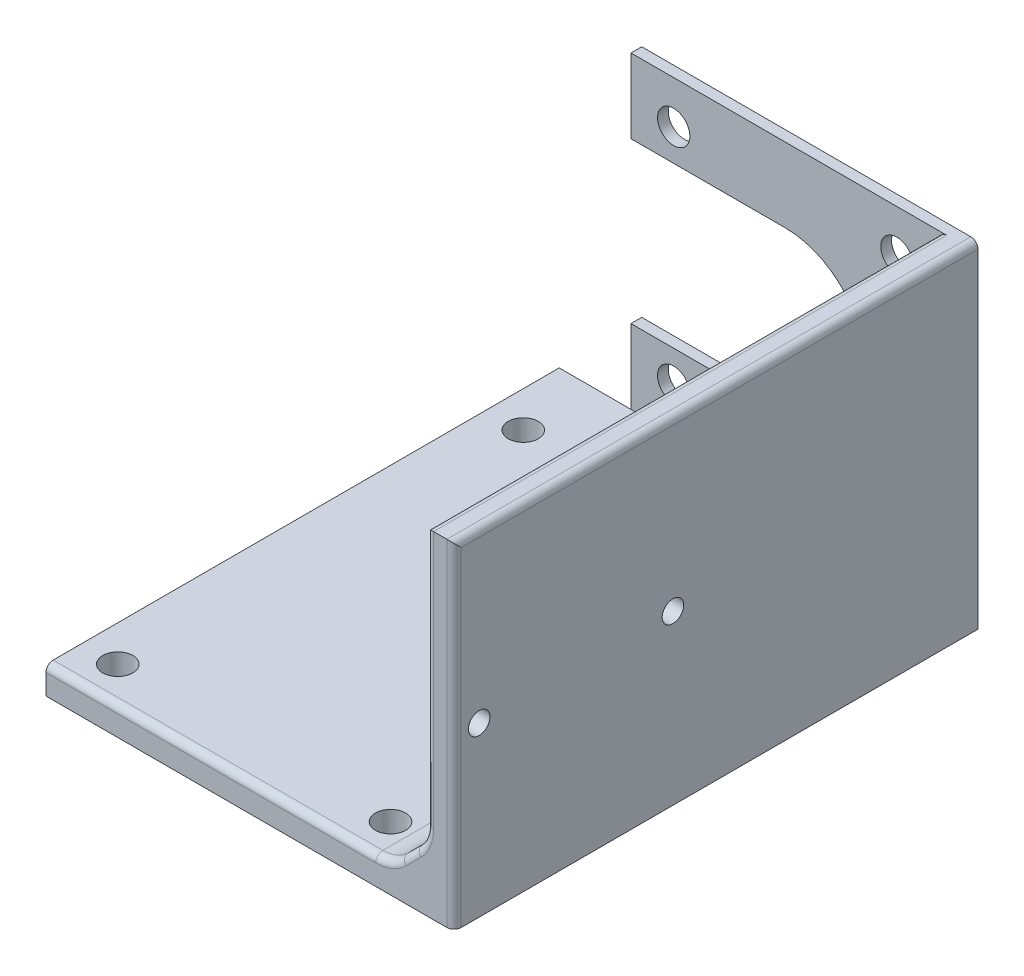
ISO-10303-21;
HEADER;
FILE_DESCRIPTION(('STEP AP214'),'2;1');
FILE_NAME('part.step','',(''),(''),'','','');
FILE_SCHEMA(('AUTOMOTIVE_DESIGN { 1 0 10303 214 1 1 1 1 }'));
ENDSEC;
DATA;
#1=APPLICATION_CONTEXT('core data for automotive mechanical design processes');
#2=APPLICATION_PROTOCOL_DEFINITION('international standard','automotive_design',2000,#1);
#3=PRODUCT_CONTEXT('',#1,'mechanical');
#4=PRODUCT('Part','Part','',(#3));
#5=PRODUCT_RELATED_PRODUCT_CATEGORY('part','',(#4));
#6=PRODUCT_DEFINITION_FORMATION('','',#4);
#7=PRODUCT_DEFINITION_CONTEXT('part definition',#1,'design');
#8=PRODUCT_DEFINITION('design','',#6,#7);
#9=PRODUCT_DEFINITION_SHAPE('','',#8);
#10=(LENGTH_UNIT() NAMED_UNIT(*) SI_UNIT(.MILLI.,.METRE.));
#11=(NAMED_UNIT(*) PLANE_ANGLE_UNIT() SI_UNIT($,.RADIAN.));
#12=(NAMED_UNIT(*) SI_UNIT($,.STERADIAN.) SOLID_ANGLE_UNIT());
#13=UNCERTAINTY_MEASURE_WITH_UNIT(LENGTH_MEASURE(1.E-05),#10,'distance_accuracy_value','');
#14=(GEOMETRIC_REPRESENTATION_CONTEXT(3) GLOBAL_UNCERTAINTY_ASSIGNED_CONTEXT((#13)) GLOBAL_UNIT_ASSIGNED_CONTEXT((#10,
#11,#12)) REPRESENTATION_CONTEXT('',''));
#15=CARTESIAN_POINT('',(0.,0.,0.));
#16=DIRECTION('',(0.,0.,1.));
#17=DIRECTION('',(1.,0.,0.));
#18=AXIS2_PLACEMENT_3D('',#15,#16,#17);
#19=CARTESIAN_POINT('',(43.,46.85,39.));
#20=DIRECTION('',(1.,0.,0.));
#21=DIRECTION('',(0.,0.,-1.));
#22=AXIS2_PLACEMENT_3D('',#19,#20,#21);
#23=PLANE('',#22);
#24=CARTESIAN_POINT('',(43.,23.425,42.5));
#25=DIRECTION('',(1.,0.,0.));
#26=DIRECTION('',(0.,0.,-1.));
#27=AXIS2_PLACEMENT_3D('',#24,#25,#26);
#28=CIRCLE('',#27,1.5);
#29=CARTESIAN_POINT('',(43.,23.425,41.));
#30=VERTEX_POINT('',#29);
#31=EDGE_CURVE('E239',#30,#30,#28,.T.);
#32=ORIENTED_EDGE('',*,*,#31,.T.);
#33=EDGE_LOOP('',(#32));
#34=FACE_BOUND('',#33,.T.);
#35=CARTESIAN_POINT('',(43.,23.425,69.5));
#36=DIRECTION('',(1.,0.,0.));
#37=DIRECTION('',(0.,0.,-1.));
#38=AXIS2_PLACEMENT_3D('',#35,#36,#37);
#39=CIRCLE('',#38,1.5);
#40=CARTESIAN_POINT('',(43.,23.425,68.));
#41=VERTEX_POINT('',#40);
#42=EDGE_CURVE('E246',#41,#41,#39,.T.);
#43=ORIENTED_EDGE('',*,*,#42,.T.);
#44=EDGE_LOOP('',(#43));
#45=FACE_BOUND('',#44,.T.);
#46=DIRECTION('',(0.,0.,1.));
#47=VECTOR('',#46,1.);
#48=CARTESIAN_POINT('',(43.,10.9210678118655,39.));
#49=LINE('',#48,#47);
#50=CARTESIAN_POINT('',(43.,10.9210678118655,43.));
#51=VERTEX_POINT('',#50);
#52=CARTESIAN_POINT('',(43.,10.9210678118655,72.));
#53=VERTEX_POINT('',#52);
#54=EDGE_CURVE('E392',#51,#53,#49,.T.);
#55=ORIENTED_EDGE('',*,*,#54,.T.);
#56=DIRECTION('',(0.,1.,0.));
#57=VECTOR('',#56,1.);
#58=CARTESIAN_POINT('',(43.,46.85,72.));
#59=LINE('',#58,#57);
#60=CARTESIAN_POINT('',(43.,45.85,72.));
#61=VERTEX_POINT('',#60);
#62=EDGE_CURVE('E438',#53,#61,#59,.T.);
#63=ORIENTED_EDGE('',*,*,#62,.T.);
#64=DIRECTION('',(0.,0.,-1.));
#65=VECTOR('',#64,1.);
#66=CARTESIAN_POINT('',(43.,45.85,39.));
#67=LINE('',#66,#65);
#68=CARTESIAN_POINT('',(43.,45.85,1.5));
#69=VERTEX_POINT('',#68);
#70=EDGE_CURVE('E435',#61,#69,#67,.T.);
#71=ORIENTED_EDGE('',*,*,#70,.T.);
#72=DIRECTION('',(0.,1.,0.));
#73=VECTOR('',#72,1.);
#74=CARTESIAN_POINT('',(43.,0.,1.5));
#75=LINE('',#74,#73);
#76=CARTESIAN_POINT('',(43.,3.85,1.5));
#77=VERTEX_POINT('',#76);
#78=EDGE_CURVE('E289',#77,#69,#75,.T.);
#79=ORIENTED_EDGE('',*,*,#78,.F.);
#80=DIRECTION('',(0.,0.,-1.));
#81=VECTOR('',#80,1.);
#82=CARTESIAN_POINT('',(43.,3.85,39.));
#83=LINE('',#82,#81);
#84=CARTESIAN_POINT('',(43.,3.85,43.));
#85=VERTEX_POINT('',#84);
#86=EDGE_CURVE('E361',#85,#77,#83,.T.);
#87=ORIENTED_EDGE('',*,*,#86,.F.);
#88=DIRECTION('',(0.,1.,0.));
#89=VECTOR('',#88,1.);
#90=CARTESIAN_POINT('',(43.,3.85,43.));
#91=LINE('',#90,#89);
#92=EDGE_CURVE('E481',#85,#51,#91,.T.);
#93=ORIENTED_EDGE('',*,*,#92,.T.);
#94=EDGE_LOOP('',(#55,#63,#71,#79,#87,#93));
#95=FACE_BOUND('',#94,.T.);
#96=ADVANCED_FACE('F43',(#34,#45,#95),#23,.F.);
#97=CARTESIAN_POINT('',(43.,3.85,39.));
#98=DIRECTION('',(0.,-1.,0.));
#99=DIRECTION('',(1.,0.,0.));
#100=AXIS2_PLACEMENT_3D('',#97,#98,#99);
#101=PLANE('',#100);
#102=CARTESIAN_POINT('',(-5.,3.85,11.5));
#103=DIRECTION('',(0.,1.,0.));
#104=DIRECTION('',(-1.,0.,0.));
#105=AXIS2_PLACEMENT_3D('',#102,#103,#104);
#106=CIRCLE('',#105,2.1);
#107=CARTESIAN_POINT('',(-7.1,3.85,11.5));
#108=VERTEX_POINT('',#107);
#109=EDGE_CURVE('E492',#108,#108,#106,.T.);
#110=ORIENTED_EDGE('',*,*,#109,.F.);
#111=EDGE_LOOP('',(#110));
#112=FACE_BOUND('',#111,.T.);
#113=CARTESIAN_POINT('',(33.,3.85,68.));
#114=DIRECTION('',(0.,1.,0.));
#115=DIRECTION('',(-1.,0.,0.));
#116=AXIS2_PLACEMENT_3D('',#113,#114,#115);
#117=CIRCLE('',#116,2.1);
#118=CARTESIAN_POINT('',(30.9,3.85,68.));
#119=VERTEX_POINT('',#118);
#120=EDGE_CURVE('E493',#119,#119,#117,.T.);
#121=ORIENTED_EDGE('',*,*,#120,.F.);
#122=EDGE_LOOP('',(#121));
#123=FACE_BOUND('',#122,.T.);
#124=CARTESIAN_POINT('',(-4.99999999999999,3.85,68.));
#125=DIRECTION('',(0.,1.,0.));
#126=DIRECTION('',(-1.,0.,0.));
#127=AXIS2_PLACEMENT_3D('',#124,#125,#126);
#128=CIRCLE('',#127,2.1);
#129=CARTESIAN_POINT('',(-7.1,3.85,68.));
#130=VERTEX_POINT('',#129);
#131=EDGE_CURVE('E376',#130,#130,#128,.T.);
#132=ORIENTED_EDGE('',*,*,#131,.F.);
#133=EDGE_LOOP('',(#132));
#134=FACE_BOUND('',#133,.T.);
#135=DIRECTION('',(0.,0.,1.));
#136=VECTOR('',#135,1.);
#137=CARTESIAN_POINT('',(-10.,3.85,1.50000000000001));
#138=LINE('',#137,#136);
#139=CARTESIAN_POINT('',(-10.,3.85,1.50000000000001));
#140=VERTEX_POINT('',#139);
#141=CARTESIAN_POINT('',(-9.99999999999999,3.85,72.));
#142=VERTEX_POINT('',#141);
#143=EDGE_CURVE('E197',#140,#142,#138,.T.);
#144=ORIENTED_EDGE('',*,*,#143,.T.);
#145=DIRECTION('',(1.,0.,0.));
#146=VECTOR('',#145,1.);
#147=CARTESIAN_POINT('',(35.9289321881345,3.85,72.));
#148=LINE('',#147,#146);
#149=CARTESIAN_POINT('',(35.9289321881345,3.85,72.));
#150=VERTEX_POINT('',#149);
#151=EDGE_CURVE('E403',#142,#150,#148,.T.);
#152=ORIENTED_EDGE('',*,*,#151,.T.);
#153=DIRECTION('',(0.,0.,1.));
#154=VECTOR('',#153,1.);
#155=CARTESIAN_POINT('',(35.9289321881345,3.85,39.));
#156=LINE('',#155,#154);
#157=CARTESIAN_POINT('',(35.9289321881345,3.85,43.));
#158=VERTEX_POINT('',#157);
#159=EDGE_CURVE('E389',#150,#158,#156,.F.);
#160=ORIENTED_EDGE('',*,*,#159,.T.);
#161=DIRECTION('',(1.,0.,0.));
#162=VECTOR('',#161,1.);
#163=CARTESIAN_POINT('',(38.,3.85,43.));
#164=LINE('',#163,#162);
#165=EDGE_CURVE('E475',#158,#85,#164,.T.);
#166=ORIENTED_EDGE('',*,*,#165,.T.);
#167=ORIENTED_EDGE('',*,*,#86,.T.);
#168=DIRECTION('',(1.,0.,0.));
#169=VECTOR('',#168,1.);
#170=CARTESIAN_POINT('',(0.,3.85,1.5));
#171=LINE('',#170,#169);
#172=CARTESIAN_POINT('',(0.,3.85,1.5));
#173=VERTEX_POINT('',#172);
#174=EDGE_CURVE('E200',#173,#77,#171,.T.);
#175=ORIENTED_EDGE('',*,*,#174,.F.);
#176=DIRECTION('',(-1.,0.,0.));
#177=VECTOR('',#176,1.);
#178=CARTESIAN_POINT('',(43.,3.85,1.5));
#179=LINE('',#178,#177);
#180=EDGE_CURVE('E192',#173,#140,#179,.T.);
#181=ORIENTED_EDGE('',*,*,#180,.T.);
#182=EDGE_LOOP('',(#144,#152,#160,#166,#167,#175,#181));
#183=FACE_BOUND('',#182,.T.);
#184=ADVANCED_FACE('F194',(#112,#123,#134,#183),#101,.F.);
#185=CARTESIAN_POINT('',(0.,3.85,39.));
#186=DIRECTION('',(1.,0.,0.));
#187=DIRECTION('',(0.,0.,-1.));
#188=AXIS2_PLACEMENT_3D('',#185,#186,#187);
#189=PLANE('',#188);
#190=DIRECTION('',(0.,0.,-1.));
#191=VECTOR('',#190,1.);
#192=CARTESIAN_POINT('',(0.,0.,39.));
#193=LINE('',#192,#191);
#194=CARTESIAN_POINT('',(0.,0.,1.50000000000001));
#195=VERTEX_POINT('',#194);
#196=CARTESIAN_POINT('',(0.,0.,0.));
#197=VERTEX_POINT('',#196);
#198=EDGE_CURVE('E367',#195,#197,#193,.T.);
#199=ORIENTED_EDGE('',*,*,#198,.F.);
#200=DIRECTION('',(0.,1.,0.));
#201=VECTOR('',#200,1.);
#202=CARTESIAN_POINT('',(0.,3.85,1.50000000000001));
#203=LINE('',#202,#201);
#204=EDGE_CURVE('E231',#195,#173,#203,.T.);
#205=ORIENTED_EDGE('',*,*,#204,.T.);
#206=DIRECTION('',(0.,-1.,0.));
#207=VECTOR('',#206,1.);
#208=CARTESIAN_POINT('',(0.,0.,1.5));
#209=LINE('',#208,#207);
#210=CARTESIAN_POINT('',(0.,14.2,1.5));
#211=VERTEX_POINT('',#210);
#212=EDGE_CURVE('E286',#211,#173,#209,.T.);
#213=ORIENTED_EDGE('',*,*,#212,.F.);
#214=DIRECTION('',(0.,0.,-1.));
#215=VECTOR('',#214,1.);
#216=CARTESIAN_POINT('',(0.,14.2,1.5));
#217=LINE('',#216,#215);
#218=CARTESIAN_POINT('',(0.,14.2,0.));
#219=VERTEX_POINT('',#218);
#220=EDGE_CURVE('E334',#211,#219,#217,.T.);
#221=ORIENTED_EDGE('',*,*,#220,.T.);
#222=DIRECTION('',(0.,-1.,0.));
#223=VECTOR('',#222,1.);
#224=CARTESIAN_POINT('',(0.,3.85,0.));
#225=LINE('',#224,#223);
#226=EDGE_CURVE('E333',#219,#197,#225,.T.);
#227=ORIENTED_EDGE('',*,*,#226,.T.);
#228=EDGE_LOOP('',(#199,#205,#213,#221,#227));
#229=FACE_BOUND('',#228,.T.);
#230=ADVANCED_FACE('F560',(#229),#189,.F.);
#231=CARTESIAN_POINT('',(0.,0.,39.));
#232=DIRECTION('',(0.,1.,0.));
#233=DIRECTION('',(0.,0.,1.));
#234=AXIS2_PLACEMENT_3D('',#231,#232,#233);
#235=PLANE('',#234);
#236=CARTESIAN_POINT('',(-5.,0.,11.5));
#237=DIRECTION('',(0.,1.,0.));
#238=DIRECTION('',(0.,0.,1.));
#239=AXIS2_PLACEMENT_3D('',#236,#237,#238);
#240=CIRCLE('',#239,2.1);
#241=CARTESIAN_POINT('',(-5.,0.,13.6));
#242=VERTEX_POINT('',#241);
#243=EDGE_CURVE('E205',#242,#242,#240,.T.);
#244=ORIENTED_EDGE('',*,*,#243,.T.);
#245=EDGE_LOOP('',(#244));
#246=FACE_BOUND('',#245,.T.);
#247=CARTESIAN_POINT('',(33.,0.,68.));
#248=DIRECTION('',(0.,1.,0.));
#249=DIRECTION('',(0.,0.,1.));
#250=AXIS2_PLACEMENT_3D('',#247,#248,#249);
#251=CIRCLE('',#250,2.1);
#252=CARTESIAN_POINT('',(33.,0.,70.1));
#253=VERTEX_POINT('',#252);
#254=EDGE_CURVE('E375',#253,#253,#251,.T.);
#255=ORIENTED_EDGE('',*,*,#254,.T.);
#256=EDGE_LOOP('',(#255));
#257=FACE_BOUND('',#256,.T.);
#258=CARTESIAN_POINT('',(-4.99999999999999,0.,68.));
#259=DIRECTION('',(0.,1.,0.));
#260=DIRECTION('',(0.,0.,1.));
#261=AXIS2_PLACEMENT_3D('',#258,#259,#260);
#262=CIRCLE('',#261,2.1);
#263=CARTESIAN_POINT('',(-4.99999999999999,0.,70.1));
#264=VERTEX_POINT('',#263);
#265=EDGE_CURVE('E371',#264,#264,#262,.T.);
#266=ORIENTED_EDGE('',*,*,#265,.T.);
#267=EDGE_LOOP('',(#266));
#268=FACE_BOUND('',#267,.T.);
#269=DIRECTION('',(0.,0.,-1.));
#270=VECTOR('',#269,1.);
#271=CARTESIAN_POINT('',(46.85,0.,39.));
#272=LINE('',#271,#270);
#273=CARTESIAN_POINT('',(46.85,0.,72.));
#274=VERTEX_POINT('',#273);
#275=CARTESIAN_POINT('',(46.85,0.,0.));
#276=VERTEX_POINT('',#275);
#277=EDGE_CURVE('E364',#274,#276,#272,.T.);
#278=ORIENTED_EDGE('',*,*,#277,.F.);
#279=CARTESIAN_POINT('',(45.85,0.,72.));
#280=DIRECTION('',(0.,1.,0.));
#281=DIRECTION('',(0.,0.,1.));
#282=AXIS2_PLACEMENT_3D('',#279,#280,#281);
#283=CIRCLE('',#282,1.);
#284=CARTESIAN_POINT('',(45.85,0.,73.));
#285=VERTEX_POINT('',#284);
#286=EDGE_CURVE('E448',#274,#285,#283,.F.);
#287=ORIENTED_EDGE('',*,*,#286,.T.);
#288=DIRECTION('',(1.,0.,0.));
#289=VECTOR('',#288,1.);
#290=CARTESIAN_POINT('',(-14.8871531516277,0.,73.));
#291=LINE('',#290,#289);
#292=CARTESIAN_POINT('',(-9.99999999999999,0.,73.));
#293=VERTEX_POINT('',#292);
#294=EDGE_CURVE('E251',#293,#285,#291,.T.);
#295=ORIENTED_EDGE('',*,*,#294,.F.);
#296=DIRECTION('',(0.,0.,-1.));
#297=VECTOR('',#296,1.);
#298=CARTESIAN_POINT('',(-10.,0.,1.50000000000001));
#299=LINE('',#298,#297);
#300=CARTESIAN_POINT('',(-10.,0.,1.50000000000001));
#301=VERTEX_POINT('',#300);
#302=EDGE_CURVE('E227',#293,#301,#299,.T.);
#303=ORIENTED_EDGE('',*,*,#302,.T.);
#304=DIRECTION('',(1.,0.,0.));
#305=VECTOR('',#304,1.);
#306=CARTESIAN_POINT('',(43.,0.,1.5));
#307=LINE('',#306,#305);
#308=EDGE_CURVE('E212',#301,#195,#307,.T.);
#309=ORIENTED_EDGE('',*,*,#308,.T.);
#310=ORIENTED_EDGE('',*,*,#198,.T.);
#311=DIRECTION('',(1.,0.,0.));
#312=VECTOR('',#311,1.);
#313=CARTESIAN_POINT('',(0.,0.,0.));
#314=LINE('',#313,#312);
#315=EDGE_CURVE('E350',#197,#276,#314,.T.);
#316=ORIENTED_EDGE('',*,*,#315,.T.);
#317=EDGE_LOOP('',(#278,#287,#295,#303,#309,#310,#316));
#318=FACE_BOUND('',#317,.T.);
#319=ADVANCED_FACE('F505',(#246,#257,#268,#318),#235,.F.);
#320=CARTESIAN_POINT('',(46.85,0.,39.));
#321=DIRECTION('',(-1.,0.,0.));
#322=DIRECTION('',(0.,0.,1.));
#323=AXIS2_PLACEMENT_3D('',#320,#321,#322);
#324=PLANE('',#323);
#325=CARTESIAN_POINT('',(46.85,23.425,69.5));
#326=DIRECTION('',(1.,0.,0.));
#327=DIRECTION('',(0.,0.,-1.));
#328=AXIS2_PLACEMENT_3D('',#325,#326,#327);
#329=CIRCLE('',#328,1.5);
#330=CARTESIAN_POINT('',(46.85,23.425,68.));
#331=VERTEX_POINT('',#330);
#332=EDGE_CURVE('E235',#331,#331,#329,.T.);
#333=ORIENTED_EDGE('',*,*,#332,.F.);
#334=EDGE_LOOP('',(#333));
#335=FACE_BOUND('',#334,.T.);
#336=CARTESIAN_POINT('',(46.85,23.425,42.5));
#337=DIRECTION('',(1.,0.,0.));
#338=DIRECTION('',(0.,0.,-1.));
#339=AXIS2_PLACEMENT_3D('',#336,#337,#338);
#340=CIRCLE('',#339,1.5);
#341=CARTESIAN_POINT('',(46.85,23.425,41.));
#342=VERTEX_POINT('',#341);
#343=EDGE_CURVE('E234',#342,#342,#340,.T.);
#344=ORIENTED_EDGE('',*,*,#343,.F.);
#345=EDGE_LOOP('',(#344));
#346=FACE_BOUND('',#345,.T.);
#347=DIRECTION('',(0.,0.,-1.));
#348=VECTOR('',#347,1.);
#349=CARTESIAN_POINT('',(46.85,45.85,39.));
#350=LINE('',#349,#348);
#351=CARTESIAN_POINT('',(46.85,45.85,0.));
#352=VERTEX_POINT('',#351);
#353=CARTESIAN_POINT('',(46.85,45.85,72.));
#354=VERTEX_POINT('',#353);
#355=EDGE_CURVE('E441',#352,#354,#350,.F.);
#356=ORIENTED_EDGE('',*,*,#355,.T.);
#357=DIRECTION('',(0.,-1.,0.));
#358=VECTOR('',#357,1.);
#359=CARTESIAN_POINT('',(46.85,0.,72.));
#360=LINE('',#359,#358);
#361=EDGE_CURVE('E444',#354,#274,#360,.T.);
#362=ORIENTED_EDGE('',*,*,#361,.T.);
#363=ORIENTED_EDGE('',*,*,#277,.T.);
#364=DIRECTION('',(0.,1.,0.));
#365=VECTOR('',#364,1.);
#366=CARTESIAN_POINT('',(46.85,0.,0.));
#367=LINE('',#366,#365);
#368=EDGE_CURVE('E354',#276,#352,#367,.T.);
#369=ORIENTED_EDGE('',*,*,#368,.T.);
#370=EDGE_LOOP('',(#356,#362,#363,#369));
#371=FACE_BOUND('',#370,.T.);
#372=ADVANCED_FACE('F569',(#335,#346,#371),#324,.F.);
#373=CARTESIAN_POINT('',(46.85,46.85,39.));
#374=DIRECTION('',(0.,-1.,0.));
#375=DIRECTION('',(0.,0.,-1.));
#376=AXIS2_PLACEMENT_3D('',#373,#374,#375);
#377=PLANE('',#376);
#378=DIRECTION('',(-1.,0.,0.));
#379=VECTOR('',#378,1.);
#380=CARTESIAN_POINT('',(0.,46.85,1.5));
#381=LINE('',#380,#379);
#382=CARTESIAN_POINT('',(44.,46.85,1.5));
#383=VERTEX_POINT('',#382);
#384=CARTESIAN_POINT('',(0.,46.85,1.5));
#385=VERTEX_POINT('',#384);
#386=EDGE_CURVE('E61',#383,#385,#381,.T.);
#387=ORIENTED_EDGE('',*,*,#386,.F.);
#388=DIRECTION('',(0.,0.,-1.));
#389=VECTOR('',#388,1.);
#390=CARTESIAN_POINT('',(44.,46.85,39.));
#391=LINE('',#390,#389);
#392=CARTESIAN_POINT('',(44.,46.85,73.));
#393=VERTEX_POINT('',#392);
#394=EDGE_CURVE('E453',#383,#393,#391,.F.);
#395=ORIENTED_EDGE('',*,*,#394,.T.);
#396=DIRECTION('',(1.,0.,0.));
#397=VECTOR('',#396,1.);
#398=CARTESIAN_POINT('',(-14.8871531516277,46.85,73.));
#399=LINE('',#398,#397);
#400=CARTESIAN_POINT('',(45.85,46.85,73.));
#401=VERTEX_POINT('',#400);
#402=EDGE_CURVE('E250',#393,#401,#399,.T.);
#403=ORIENTED_EDGE('',*,*,#402,.T.);
#404=DIRECTION('',(0.,0.,-1.));
#405=VECTOR('',#404,1.);
#406=CARTESIAN_POINT('',(45.85,46.85,39.));
#407=LINE('',#406,#405);
#408=CARTESIAN_POINT('',(45.85,46.85,0.));
#409=VERTEX_POINT('',#408);
#410=EDGE_CURVE('E67',#401,#409,#407,.T.);
#411=ORIENTED_EDGE('',*,*,#410,.T.);
#412=DIRECTION('',(-1.,0.,0.));
#413=VECTOR('',#412,1.);
#414=CARTESIAN_POINT('',(46.85,46.85,0.));
#415=LINE('',#414,#413);
#416=CARTESIAN_POINT('',(0.,46.85,0.));
#417=VERTEX_POINT('',#416);
#418=EDGE_CURVE('E358',#409,#417,#415,.T.);
#419=ORIENTED_EDGE('',*,*,#418,.T.);
#420=DIRECTION('',(0.,0.,-1.));
#421=VECTOR('',#420,1.);
#422=CARTESIAN_POINT('',(0.,46.85,1.5));
#423=LINE('',#422,#421);
#424=EDGE_CURVE('E338',#385,#417,#423,.T.);
#425=ORIENTED_EDGE('',*,*,#424,.F.);
#426=EDGE_LOOP('',(#387,#395,#403,#411,#419,#425));
#427=FACE_BOUND('',#426,.T.);
#428=ADVANCED_FACE('F577',(#427),#377,.F.);
#429=CARTESIAN_POINT('',(0.,0.,0.));
#430=DIRECTION('',(0.,0.,1.));
#431=DIRECTION('',(1.,0.,0.));
#432=AXIS2_PLACEMENT_3D('',#429,#430,#431);
#433=PLANE('',#432);
#434=ORIENTED_EDGE('',*,*,#418,.F.);
#435=CARTESIAN_POINT('',(45.85,45.85,0.));
#436=DIRECTION('',(0.,0.,1.));
#437=DIRECTION('',(1.,0.,0.));
#438=AXIS2_PLACEMENT_3D('',#435,#436,#437);
#439=CIRCLE('',#438,1.);
#440=EDGE_CURVE('E53',#409,#352,#439,.F.);
#441=ORIENTED_EDGE('',*,*,#440,.T.);
#442=ORIENTED_EDGE('',*,*,#368,.F.);
#443=ORIENTED_EDGE('',*,*,#315,.F.);
#444=ORIENTED_EDGE('',*,*,#226,.F.);
#445=DIRECTION('',(-1.,0.,0.));
#446=VECTOR('',#445,1.);
#447=CARTESIAN_POINT('',(0.,14.2,0.));
#448=LINE('',#447,#446);
#449=CARTESIAN_POINT('',(21.5,14.2,0.));
#450=VERTEX_POINT('',#449);
#451=EDGE_CURVE('E263',#450,#219,#448,.T.);
#452=ORIENTED_EDGE('',*,*,#451,.F.);
#453=CARTESIAN_POINT('',(21.5,25.35,0.));
#454=DIRECTION('',(0.,0.,-1.));
#455=DIRECTION('',(-1.,0.,0.));
#456=AXIS2_PLACEMENT_3D('',#453,#454,#455);
#457=CIRCLE('',#456,11.15);
#458=CARTESIAN_POINT('',(21.5,36.5,0.));
#459=VERTEX_POINT('',#458);
#460=EDGE_CURVE('E314',#459,#450,#457,.T.);
#461=ORIENTED_EDGE('',*,*,#460,.F.);
#462=DIRECTION('',(-1.,0.,0.));
#463=VECTOR('',#462,1.);
#464=CARTESIAN_POINT('',(0.,36.5,0.));
#465=LINE('',#464,#463);
#466=CARTESIAN_POINT('',(0.,36.5,0.));
#467=VERTEX_POINT('',#466);
#468=EDGE_CURVE('E318',#459,#467,#465,.T.);
#469=ORIENTED_EDGE('',*,*,#468,.T.);
#470=DIRECTION('',(0.,-1.,0.));
#471=VECTOR('',#470,1.);
#472=CARTESIAN_POINT('',(0.,0.,0.));
#473=LINE('',#472,#471);
#474=EDGE_CURVE('E322',#417,#467,#473,.T.);
#475=ORIENTED_EDGE('',*,*,#474,.F.);
#476=EDGE_LOOP('',(#434,#441,#442,#443,#444,#452,#461,#469,#475));
#477=FACE_BOUND('',#476,.T.);
#478=CARTESIAN_POINT('',(5.94999999999999,9.80000000000001,0.));
#479=DIRECTION('',(0.,0.,-1.));
#480=DIRECTION('',(-1.,0.,0.));
#481=AXIS2_PLACEMENT_3D('',#478,#479,#480);
#482=CIRCLE('',#481,2.25);
#483=CARTESIAN_POINT('',(3.69999999999999,9.80000000000001,0.));
#484=VERTEX_POINT('',#483);
#485=EDGE_CURVE('E255',#484,#484,#482,.T.);
#486=ORIENTED_EDGE('',*,*,#485,.F.);
#487=EDGE_LOOP('',(#486));
#488=FACE_BOUND('',#487,.T.);
#489=CARTESIAN_POINT('',(37.05,9.79999999999999,0.));
#490=DIRECTION('',(0.,0.,-1.));
#491=DIRECTION('',(-1.,0.,0.));
#492=AXIS2_PLACEMENT_3D('',#489,#490,#491);
#493=CIRCLE('',#492,2.25);
#494=CARTESIAN_POINT('',(34.8,9.79999999999999,0.));
#495=VERTEX_POINT('',#494);
#496=EDGE_CURVE('E302',#495,#495,#493,.T.);
#497=ORIENTED_EDGE('',*,*,#496,.F.);
#498=EDGE_LOOP('',(#497));
#499=FACE_BOUND('',#498,.T.);
#500=CARTESIAN_POINT('',(37.05,40.9,0.));
#501=DIRECTION('',(0.,0.,-1.));
#502=DIRECTION('',(-1.,0.,0.));
#503=AXIS2_PLACEMENT_3D('',#500,#501,#502);
#504=CIRCLE('',#503,2.25);
#505=CARTESIAN_POINT('',(34.8,40.9,0.));
#506=VERTEX_POINT('',#505);
#507=EDGE_CURVE('E306',#506,#506,#504,.T.);
#508=ORIENTED_EDGE('',*,*,#507,.F.);
#509=EDGE_LOOP('',(#508));
#510=FACE_BOUND('',#509,.T.);
#511=CARTESIAN_POINT('',(5.95,40.9,0.));
#512=DIRECTION('',(0.,0.,-1.));
#513=DIRECTION('',(-1.,0.,0.));
#514=AXIS2_PLACEMENT_3D('',#511,#512,#513);
#515=CIRCLE('',#514,2.25);
#516=CARTESIAN_POINT('',(3.7,40.9,0.));
#517=VERTEX_POINT('',#516);
#518=EDGE_CURVE('E310',#517,#517,#515,.T.);
#519=ORIENTED_EDGE('',*,*,#518,.F.);
#520=EDGE_LOOP('',(#519));
#521=FACE_BOUND('',#520,.T.);
#522=ADVANCED_FACE('F564',(#477,#488,#499,#510,#521),#433,.F.);
#523=CARTESIAN_POINT('',(21.5,25.35,1.5));
#524=DIRECTION('',(0.,0.,-1.));
#525=DIRECTION('',(-1.,0.,0.));
#526=AXIS2_PLACEMENT_3D('',#523,#524,#525);
#527=CYLINDRICAL_SURFACE('',#526,11.15);
#528=ORIENTED_EDGE('',*,*,#460,.T.);
#529=DIRECTION('',(0.,0.,-1.));
#530=VECTOR('',#529,1.);
#531=CARTESIAN_POINT('',(21.5,14.2,1.5));
#532=LINE('',#531,#530);
#533=CARTESIAN_POINT('',(21.5,14.2,1.5));
#534=VERTEX_POINT('',#533);
#535=EDGE_CURVE('E329',#534,#450,#532,.T.);
#536=ORIENTED_EDGE('',*,*,#535,.F.);
#537=CARTESIAN_POINT('',(21.5,25.35,1.5));
#538=DIRECTION('',(0.,0.,-1.));
#539=DIRECTION('',(-1.,0.,0.));
#540=AXIS2_PLACEMENT_3D('',#537,#538,#539);
#541=CIRCLE('',#540,11.15);
#542=CARTESIAN_POINT('',(21.5,36.5,1.5));
#543=VERTEX_POINT('',#542);
#544=EDGE_CURVE('E275',#543,#534,#541,.T.);
#545=ORIENTED_EDGE('',*,*,#544,.F.);
#546=DIRECTION('',(0.,0.,-1.));
#547=VECTOR('',#546,1.);
#548=CARTESIAN_POINT('',(21.5,36.5,1.5));
#549=LINE('',#548,#547);
#550=EDGE_CURVE('E298',#543,#459,#549,.T.);
#551=ORIENTED_EDGE('',*,*,#550,.T.);
#552=EDGE_LOOP('',(#528,#536,#545,#551));
#553=FACE_BOUND('',#552,.T.);
#554=ADVANCED_FACE('F584',(#553),#527,.F.);
#555=CARTESIAN_POINT('',(0.,14.2,1.5));
#556=DIRECTION('',(0.,-1.,0.));
#557=DIRECTION('',(0.,0.,-1.));
#558=AXIS2_PLACEMENT_3D('',#555,#556,#557);
#559=PLANE('',#558);
#560=ORIENTED_EDGE('',*,*,#451,.T.);
#561=ORIENTED_EDGE('',*,*,#220,.F.);
#562=DIRECTION('',(-1.,0.,0.));
#563=VECTOR('',#562,1.);
#564=CARTESIAN_POINT('',(0.,14.2,1.5));
#565=LINE('',#564,#563);
#566=EDGE_CURVE('E295',#534,#211,#565,.T.);
#567=ORIENTED_EDGE('',*,*,#566,.F.);
#568=ORIENTED_EDGE('',*,*,#535,.T.);
#569=EDGE_LOOP('',(#560,#561,#567,#568));
#570=FACE_BOUND('',#569,.T.);
#571=ADVANCED_FACE('F619',(#570),#559,.F.);
#572=CARTESIAN_POINT('',(0.,0.,1.5));
#573=DIRECTION('',(1.,0.,0.));
#574=DIRECTION('',(0.,0.,-1.));
#575=AXIS2_PLACEMENT_3D('',#572,#573,#574);
#576=PLANE('',#575);
#577=ORIENTED_EDGE('',*,*,#474,.T.);
#578=DIRECTION('',(0.,0.,-1.));
#579=VECTOR('',#578,1.);
#580=CARTESIAN_POINT('',(0.,36.5,1.5));
#581=LINE('',#580,#579);
#582=CARTESIAN_POINT('',(0.,36.5,1.5));
#583=VERTEX_POINT('',#582);
#584=EDGE_CURVE('E342',#583,#467,#581,.T.);
#585=ORIENTED_EDGE('',*,*,#584,.F.);
#586=EDGE_CURVE('E283',#385,#583,#209,.T.);
#587=ORIENTED_EDGE('',*,*,#586,.F.);
#588=ORIENTED_EDGE('',*,*,#424,.T.);
#589=EDGE_LOOP('',(#577,#585,#587,#588));
#590=FACE_BOUND('',#589,.T.);
#591=ADVANCED_FACE('F615',(#590),#576,.F.);
#592=CARTESIAN_POINT('',(5.95,40.9,1.5));
#593=DIRECTION('',(0.,0.,-1.));
#594=DIRECTION('',(-1.,0.,0.));
#595=AXIS2_PLACEMENT_3D('',#592,#593,#594);
#596=CYLINDRICAL_SURFACE('',#595,2.25);
#597=CARTESIAN_POINT('',(5.95,40.9,1.5));
#598=DIRECTION('',(0.,0.,-1.));
#599=DIRECTION('',(-1.,0.,0.));
#600=AXIS2_PLACEMENT_3D('',#597,#598,#599);
#601=CIRCLE('',#600,2.25);
#602=CARTESIAN_POINT('',(3.7,40.9,1.5));
#603=VERTEX_POINT('',#602);
#604=EDGE_CURVE('E271',#603,#603,#601,.T.);
#605=ORIENTED_EDGE('',*,*,#604,.F.);
#606=EDGE_LOOP('',(#605));
#607=FACE_BOUND('',#606,.T.);
#608=ORIENTED_EDGE('',*,*,#518,.T.);
#609=EDGE_LOOP('',(#608));
#610=FACE_BOUND('',#609,.T.);
#611=ADVANCED_FACE('F611',(#607,#610),#596,.F.);
#612=CARTESIAN_POINT('',(37.05,40.9,1.5));
#613=DIRECTION('',(0.,0.,-1.));
#614=DIRECTION('',(-1.,0.,0.));
#615=AXIS2_PLACEMENT_3D('',#612,#613,#614);
#616=CYLINDRICAL_SURFACE('',#615,2.25);
#617=CARTESIAN_POINT('',(37.05,40.9,1.5));
#618=DIRECTION('',(0.,0.,-1.));
#619=DIRECTION('',(-1.,0.,0.));
#620=AXIS2_PLACEMENT_3D('',#617,#618,#619);
#621=CIRCLE('',#620,2.25);
#622=CARTESIAN_POINT('',(34.8,40.9,1.5));
#623=VERTEX_POINT('',#622);
#624=EDGE_CURVE('E267',#623,#623,#621,.T.);
#625=ORIENTED_EDGE('',*,*,#624,.F.);
#626=EDGE_LOOP('',(#625));
#627=FACE_BOUND('',#626,.T.);
#628=ORIENTED_EDGE('',*,*,#507,.T.);
#629=EDGE_LOOP('',(#628));
#630=FACE_BOUND('',#629,.T.);
#631=ADVANCED_FACE('F607',(#627,#630),#616,.F.);
#632=CARTESIAN_POINT('',(37.05,9.79999999999999,1.5));
#633=DIRECTION('',(0.,0.,-1.));
#634=DIRECTION('',(-1.,0.,0.));
#635=AXIS2_PLACEMENT_3D('',#632,#633,#634);
#636=CYLINDRICAL_SURFACE('',#635,2.25);
#637=CARTESIAN_POINT('',(37.05,9.79999999999999,1.5));
#638=DIRECTION('',(0.,0.,-1.));
#639=DIRECTION('',(-1.,0.,0.));
#640=AXIS2_PLACEMENT_3D('',#637,#638,#639);
#641=CIRCLE('',#640,2.25);
#642=CARTESIAN_POINT('',(34.8,9.79999999999999,1.5));
#643=VERTEX_POINT('',#642);
#644=EDGE_CURVE('E262',#643,#643,#641,.T.);
#645=ORIENTED_EDGE('',*,*,#644,.F.);
#646=EDGE_LOOP('',(#645));
#647=FACE_BOUND('',#646,.T.);
#648=ORIENTED_EDGE('',*,*,#496,.T.);
#649=EDGE_LOOP('',(#648));
#650=FACE_BOUND('',#649,.T.);
#651=ADVANCED_FACE('F603',(#647,#650),#636,.F.);
#652=CARTESIAN_POINT('',(5.94999999999999,9.80000000000001,1.5));
#653=DIRECTION('',(0.,0.,-1.));
#654=DIRECTION('',(-1.,0.,0.));
#655=AXIS2_PLACEMENT_3D('',#652,#653,#654);
#656=CYLINDRICAL_SURFACE('',#655,2.25);
#657=CARTESIAN_POINT('',(5.94999999999999,9.80000000000001,1.5));
#658=DIRECTION('',(0.,0.,-1.));
#659=DIRECTION('',(-1.,0.,0.));
#660=AXIS2_PLACEMENT_3D('',#657,#658,#659);
#661=CIRCLE('',#660,2.25);
#662=CARTESIAN_POINT('',(3.69999999999999,9.80000000000001,1.5));
#663=VERTEX_POINT('',#662);
#664=EDGE_CURVE('E258',#663,#663,#661,.T.);
#665=ORIENTED_EDGE('',*,*,#664,.F.);
#666=EDGE_LOOP('',(#665));
#667=FACE_BOUND('',#666,.T.);
#668=ORIENTED_EDGE('',*,*,#485,.T.);
#669=EDGE_LOOP('',(#668));
#670=FACE_BOUND('',#669,.T.);
#671=ADVANCED_FACE('F599',(#667,#670),#656,.F.);
#672=CARTESIAN_POINT('',(0.,36.5,1.5));
#673=DIRECTION('',(0.,-1.,0.));
#674=DIRECTION('',(0.,0.,-1.));
#675=AXIS2_PLACEMENT_3D('',#672,#673,#674);
#676=PLANE('',#675);
#677=ORIENTED_EDGE('',*,*,#468,.F.);
#678=ORIENTED_EDGE('',*,*,#550,.F.);
#679=DIRECTION('',(-1.,0.,0.));
#680=VECTOR('',#679,1.);
#681=CARTESIAN_POINT('',(0.,36.5,1.5));
#682=LINE('',#681,#680);
#683=EDGE_CURVE('E279',#543,#583,#682,.T.);
#684=ORIENTED_EDGE('',*,*,#683,.T.);
#685=ORIENTED_EDGE('',*,*,#584,.T.);
#686=EDGE_LOOP('',(#677,#678,#684,#685));
#687=FACE_BOUND('',#686,.T.);
#688=ADVANCED_FACE('F602',(#687),#676,.T.);
#689=CARTESIAN_POINT('',(0.,0.,1.5));
#690=DIRECTION('',(0.,0.,-1.));
#691=DIRECTION('',(-1.,0.,0.));
#692=AXIS2_PLACEMENT_3D('',#689,#690,#691);
#693=PLANE('',#692);
#694=ORIENTED_EDGE('',*,*,#664,.T.);
#695=EDGE_LOOP('',(#694));
#696=FACE_BOUND('',#695,.T.);
#697=ORIENTED_EDGE('',*,*,#644,.T.);
#698=EDGE_LOOP('',(#697));
#699=FACE_BOUND('',#698,.T.);
#700=ORIENTED_EDGE('',*,*,#624,.T.);
#701=EDGE_LOOP('',(#700));
#702=FACE_BOUND('',#701,.T.);
#703=ORIENTED_EDGE('',*,*,#604,.T.);
#704=EDGE_LOOP('',(#703));
#705=FACE_BOUND('',#704,.T.);
#706=ORIENTED_EDGE('',*,*,#544,.T.);
#707=ORIENTED_EDGE('',*,*,#566,.T.);
#708=ORIENTED_EDGE('',*,*,#212,.T.);
#709=ORIENTED_EDGE('',*,*,#174,.T.);
#710=ORIENTED_EDGE('',*,*,#78,.T.);
#711=CARTESIAN_POINT('',(44.,45.85,1.5));
#712=DIRECTION('',(0.,0.,-1.));
#713=DIRECTION('',(-1.,0.,0.));
#714=AXIS2_PLACEMENT_3D('',#711,#712,#713);
#715=CIRCLE('',#714,1.);
#716=EDGE_CURVE('E11',#69,#383,#715,.T.);
#717=ORIENTED_EDGE('',*,*,#716,.T.);
#718=ORIENTED_EDGE('',*,*,#386,.T.);
#719=ORIENTED_EDGE('',*,*,#586,.T.);
#720=ORIENTED_EDGE('',*,*,#683,.F.);
#721=EDGE_LOOP('',(#706,#707,#708,#709,#710,#717,#718,#719,#720));
#722=FACE_BOUND('',#721,.T.);
#723=ADVANCED_FACE('F555',(#696,#699,#702,#705,#722),#693,.F.);
#724=CARTESIAN_POINT('',(-14.8871531516277,46.85,73.));
#725=DIRECTION('',(0.,0.,1.));
#726=DIRECTION('',(1.,0.,0.));
#727=AXIS2_PLACEMENT_3D('',#724,#725,#726);
#728=PLANE('',#727);
#729=CARTESIAN_POINT('',(35.9289321881345,8.85,73.));
#730=DIRECTION('',(0.,0.,1.));
#731=DIRECTION('',(1.,0.,0.));
#732=AXIS2_PLACEMENT_3D('',#729,#730,#731);
#733=CIRCLE('',#732,6.);
#734=CARTESIAN_POINT('',(40.1715728752538,4.60735931288072,73.));
#735=VERTEX_POINT('',#734);
#736=CARTESIAN_POINT('',(35.9289321881345,2.85,73.));
#737=VERTEX_POINT('',#736);
#738=EDGE_CURVE('E418',#735,#737,#733,.F.);
#739=ORIENTED_EDGE('',*,*,#738,.T.);
#740=DIRECTION('',(1.,0.,0.));
#741=VECTOR('',#740,1.);
#742=CARTESIAN_POINT('',(-9.99999999999999,2.85,73.));
#743=LINE('',#742,#741);
#744=CARTESIAN_POINT('',(-9.99999999999999,2.85000000000001,73.));
#745=VERTEX_POINT('',#744);
#746=EDGE_CURVE('E421',#737,#745,#743,.F.);
#747=ORIENTED_EDGE('',*,*,#746,.T.);
#748=DIRECTION('',(0.,1.,0.));
#749=VECTOR('',#748,1.);
#750=CARTESIAN_POINT('',(-9.99999999999999,-89.0014044833001,73.));
#751=LINE('',#750,#749);
#752=EDGE_CURVE('E216',#293,#745,#751,.T.);
#753=ORIENTED_EDGE('',*,*,#752,.F.);
#754=ORIENTED_EDGE('',*,*,#294,.T.);
#755=DIRECTION('',(0.,-1.,0.));
#756=VECTOR('',#755,1.);
#757=CARTESIAN_POINT('',(45.85,46.85,73.));
#758=LINE('',#757,#756);
#759=EDGE_CURVE('E406',#285,#401,#758,.F.);
#760=ORIENTED_EDGE('',*,*,#759,.T.);
#761=ORIENTED_EDGE('',*,*,#402,.F.);
#762=DIRECTION('',(0.,1.,0.));
#763=VECTOR('',#762,1.);
#764=CARTESIAN_POINT('',(44.,10.9210678118655,73.));
#765=LINE('',#764,#763);
#766=CARTESIAN_POINT('',(44.,10.9210678118655,73.));
#767=VERTEX_POINT('',#766);
#768=EDGE_CURVE('E409',#393,#767,#765,.F.);
#769=ORIENTED_EDGE('',*,*,#768,.T.);
#770=CARTESIAN_POINT('',(38.,10.9210678118655,73.));
#771=DIRECTION('',(0.,0.,1.));
#772=DIRECTION('',(1.,0.,0.));
#773=AXIS2_PLACEMENT_3D('',#770,#771,#772);
#774=CIRCLE('',#773,6.);
#775=CARTESIAN_POINT('',(42.2426406871193,6.6784271247462,73.));
#776=VERTEX_POINT('',#775);
#777=EDGE_CURVE('E412',#767,#776,#774,.F.);
#778=ORIENTED_EDGE('',*,*,#777,.T.);
#779=DIRECTION('',(-0.707106781186547,-0.707106781186548,0.));
#780=VECTOR('',#779,1.);
#781=CARTESIAN_POINT('',(33.7635302053727,-1.80068335700036,73.));
#782=LINE('',#781,#780);
#783=EDGE_CURVE('E415',#776,#735,#782,.T.);
#784=ORIENTED_EDGE('',*,*,#783,.T.);
#785=EDGE_LOOP('',(#739,#747,#753,#754,#760,#761,#769,#778,#784));
#786=FACE_BOUND('',#785,.T.);
#787=ADVANCED_FACE('F508',(#786),#728,.T.);
#788=CARTESIAN_POINT('',(40.35,23.425,42.5));
#789=DIRECTION('',(1.,0.,0.));
#790=DIRECTION('',(0.,0.,-1.));
#791=AXIS2_PLACEMENT_3D('',#788,#789,#790);
#792=CYLINDRICAL_SURFACE('',#791,1.5);
#793=ORIENTED_EDGE('',*,*,#343,.T.);
#794=EDGE_LOOP('',(#793));
#795=FACE_BOUND('',#794,.T.);
#796=ORIENTED_EDGE('',*,*,#31,.F.);
#797=EDGE_LOOP('',(#796));
#798=FACE_BOUND('',#797,.T.);
#799=ADVANCED_FACE('F635',(#795,#798),#792,.F.);
#800=CARTESIAN_POINT('',(40.35,23.425,69.5));
#801=DIRECTION('',(1.,0.,0.));
#802=DIRECTION('',(0.,0.,-1.));
#803=AXIS2_PLACEMENT_3D('',#800,#801,#802);
#804=CYLINDRICAL_SURFACE('',#803,1.5);
#805=ORIENTED_EDGE('',*,*,#332,.T.);
#806=EDGE_LOOP('',(#805));
#807=FACE_BOUND('',#806,.T.);
#808=ORIENTED_EDGE('',*,*,#42,.F.);
#809=EDGE_LOOP('',(#808));
#810=FACE_BOUND('',#809,.T.);
#811=ADVANCED_FACE('F638',(#807,#810),#804,.F.);
#812=CARTESIAN_POINT('',(43.,-89.0014044833001,1.5));
#813=DIRECTION('',(0.,0.,-1.));
#814=DIRECTION('',(-1.,0.,0.));
#815=AXIS2_PLACEMENT_3D('',#812,#813,#814);
#816=PLANE('',#815);
#817=ORIENTED_EDGE('',*,*,#204,.F.);
#818=ORIENTED_EDGE('',*,*,#308,.F.);
#819=DIRECTION('',(0.,1.,0.));
#820=VECTOR('',#819,1.);
#821=CARTESIAN_POINT('',(-9.99999999999999,-89.0014044833001,1.50000000000001));
#822=LINE('',#821,#820);
#823=EDGE_CURVE('E209',#301,#140,#822,.T.);
#824=ORIENTED_EDGE('',*,*,#823,.T.);
#825=ORIENTED_EDGE('',*,*,#180,.F.);
#826=EDGE_LOOP('',(#817,#818,#824,#825));
#827=FACE_BOUND('',#826,.T.);
#828=ADVANCED_FACE('F210',(#827),#816,.T.);
#829=CARTESIAN_POINT('',(-9.99999999999999,-89.0014044833001,1.50000000000001));
#830=DIRECTION('',(-1.,0.,0.));
#831=DIRECTION('',(0.,0.,1.));
#832=AXIS2_PLACEMENT_3D('',#829,#830,#831);
#833=PLANE('',#832);
#834=ORIENTED_EDGE('',*,*,#752,.T.);
#835=CARTESIAN_POINT('',(-9.99999999999999,2.85,72.));
#836=DIRECTION('',(-1.,0.,0.));
#837=DIRECTION('',(0.,0.,1.));
#838=AXIS2_PLACEMENT_3D('',#835,#836,#837);
#839=CIRCLE('',#838,1.);
#840=EDGE_CURVE('E221',#745,#142,#839,.T.);
#841=ORIENTED_EDGE('',*,*,#840,.T.);
#842=ORIENTED_EDGE('',*,*,#143,.F.);
#843=ORIENTED_EDGE('',*,*,#823,.F.);
#844=ORIENTED_EDGE('',*,*,#302,.F.);
#845=EDGE_LOOP('',(#834,#841,#842,#843,#844));
#846=FACE_BOUND('',#845,.T.);
#847=ADVANCED_FACE('F219',(#846),#833,.T.);
#848=CARTESIAN_POINT('',(-4.99999999999999,-2.65,68.));
#849=DIRECTION('',(0.,1.,0.));
#850=DIRECTION('',(-1.,0.,0.));
#851=AXIS2_PLACEMENT_3D('',#848,#849,#850);
#852=CYLINDRICAL_SURFACE('',#851,2.1);
#853=ORIENTED_EDGE('',*,*,#131,.T.);
#854=EDGE_LOOP('',(#853));
#855=FACE_BOUND('',#854,.T.);
#856=ORIENTED_EDGE('',*,*,#265,.F.);
#857=EDGE_LOOP('',(#856));
#858=FACE_BOUND('',#857,.T.);
#859=ADVANCED_FACE('F647',(#855,#858),#852,.F.);
#860=CARTESIAN_POINT('',(33.,-2.65,68.));
#861=DIRECTION('',(0.,1.,0.));
#862=DIRECTION('',(-1.,0.,0.));
#863=AXIS2_PLACEMENT_3D('',#860,#861,#862);
#864=CYLINDRICAL_SURFACE('',#863,2.1);
#865=ORIENTED_EDGE('',*,*,#120,.T.);
#866=EDGE_LOOP('',(#865));
#867=FACE_BOUND('',#866,.T.);
#868=ORIENTED_EDGE('',*,*,#254,.F.);
#869=EDGE_LOOP('',(#868));
#870=FACE_BOUND('',#869,.T.);
#871=ADVANCED_FACE('F650',(#867,#870),#864,.F.);
#872=CARTESIAN_POINT('',(-5.,-2.65,11.5));
#873=DIRECTION('',(0.,1.,0.));
#874=DIRECTION('',(-1.,0.,0.));
#875=AXIS2_PLACEMENT_3D('',#872,#873,#874);
#876=CYLINDRICAL_SURFACE('',#875,2.1);
#877=ORIENTED_EDGE('',*,*,#109,.T.);
#878=EDGE_LOOP('',(#877));
#879=FACE_BOUND('',#878,.T.);
#880=ORIENTED_EDGE('',*,*,#243,.F.);
#881=EDGE_LOOP('',(#880));
#882=FACE_BOUND('',#881,.T.);
#883=ADVANCED_FACE('F652',(#879,#882),#876,.F.);
#884=CARTESIAN_POINT('',(43.,8.85,43.));
#885=DIRECTION('',(-0.707106781186548,0.707106781186547,0.));
#886=DIRECTION('',(-0.707106781186547,-0.707106781186548,0.));
#887=AXIS2_PLACEMENT_3D('',#884,#885,#886);
#888=PLANE('',#887);
#889=DIRECTION('',(0.,0.,1.));
#890=VECTOR('',#889,1.);
#891=CARTESIAN_POINT('',(39.4644660940673,5.31446609406727,43.));
#892=LINE('',#891,#890);
#893=CARTESIAN_POINT('',(39.4644660940673,5.31446609406727,43.));
#894=VERTEX_POINT('',#893);
#895=CARTESIAN_POINT('',(39.4644660940673,5.31446609406727,72.));
#896=VERTEX_POINT('',#895);
#897=EDGE_CURVE('E385',#894,#896,#892,.T.);
#898=ORIENTED_EDGE('',*,*,#897,.T.);
#899=DIRECTION('',(-0.707106781186547,-0.707106781186548,0.));
#900=VECTOR('',#899,1.);
#901=CARTESIAN_POINT('',(43.,8.85,72.));
#902=LINE('',#901,#900);
#903=CARTESIAN_POINT('',(41.5355339059327,7.38553390593274,72.));
#904=VERTEX_POINT('',#903);
#905=EDGE_CURVE('E429',#896,#904,#902,.F.);
#906=ORIENTED_EDGE('',*,*,#905,.T.);
#907=DIRECTION('',(0.,0.,1.));
#908=VECTOR('',#907,1.);
#909=CARTESIAN_POINT('',(41.5355339059327,7.38553390593274,43.));
#910=LINE('',#909,#908);
#911=CARTESIAN_POINT('',(41.5355339059327,7.38553390593274,43.));
#912=VERTEX_POINT('',#911);
#913=EDGE_CURVE('E370',#904,#912,#910,.F.);
#914=ORIENTED_EDGE('',*,*,#913,.T.);
#915=DIRECTION('',(-0.707106781186547,-0.707106781186548,0.));
#916=VECTOR('',#915,1.);
#917=CARTESIAN_POINT('',(43.,8.85,43.));
#918=LINE('',#917,#916);
#919=EDGE_CURVE('E486',#912,#894,#918,.T.);
#920=ORIENTED_EDGE('',*,*,#919,.T.);
#921=EDGE_LOOP('',(#898,#906,#914,#920));
#922=FACE_BOUND('',#921,.T.);
#923=ADVANCED_FACE('F530',(#922),#888,.T.);
#924=CARTESIAN_POINT('',(0.,0.,43.));
#925=DIRECTION('',(0.,0.,1.));
#926=DIRECTION('',(1.,0.,0.));
#927=AXIS2_PLACEMENT_3D('',#924,#925,#926);
#928=PLANE('',#927);
#929=ORIENTED_EDGE('',*,*,#165,.F.);
#930=CARTESIAN_POINT('',(35.9289321881345,8.85,43.));
#931=DIRECTION('',(0.,0.,1.));
#932=DIRECTION('',(1.,0.,0.));
#933=AXIS2_PLACEMENT_3D('',#930,#931,#932);
#934=CIRCLE('',#933,5.);
#935=EDGE_CURVE('E396',#158,#894,#934,.T.);
#936=ORIENTED_EDGE('',*,*,#935,.T.);
#937=ORIENTED_EDGE('',*,*,#919,.F.);
#938=CARTESIAN_POINT('',(38.,10.9210678118655,43.));
#939=DIRECTION('',(0.,0.,1.));
#940=DIRECTION('',(1.,0.,0.));
#941=AXIS2_PLACEMENT_3D('',#938,#939,#940);
#942=CIRCLE('',#941,5.);
#943=EDGE_CURVE('E399',#912,#51,#942,.T.);
#944=ORIENTED_EDGE('',*,*,#943,.T.);
#945=ORIENTED_EDGE('',*,*,#92,.F.);
#946=EDGE_LOOP('',(#929,#936,#937,#944,#945));
#947=FACE_BOUND('',#946,.T.);
#948=ADVANCED_FACE('F526',(#947),#928,.F.);
#949=CARTESIAN_POINT('',(35.9289321881345,8.85,43.));
#950=DIRECTION('',(0.,0.,1.));
#951=DIRECTION('',(1.,0.,0.));
#952=AXIS2_PLACEMENT_3D('',#949,#950,#951);
#953=CYLINDRICAL_SURFACE('',#952,5.);
#954=ORIENTED_EDGE('',*,*,#159,.F.);
#955=CARTESIAN_POINT('',(35.9289321881345,8.85,72.));
#956=DIRECTION('',(0.,0.,1.));
#957=DIRECTION('',(1.,0.,0.));
#958=AXIS2_PLACEMENT_3D('',#955,#956,#957);
#959=CIRCLE('',#958,5.);
#960=EDGE_CURVE('E426',#150,#896,#959,.T.);
#961=ORIENTED_EDGE('',*,*,#960,.T.);
#962=ORIENTED_EDGE('',*,*,#897,.F.);
#963=ORIENTED_EDGE('',*,*,#935,.F.);
#964=EDGE_LOOP('',(#954,#961,#962,#963));
#965=FACE_BOUND('',#964,.T.);
#966=ADVANCED_FACE('F523',(#965),#953,.F.);
#967=CARTESIAN_POINT('',(38.,10.9210678118655,39.));
#968=DIRECTION('',(0.,0.,1.));
#969=DIRECTION('',(1.,0.,0.));
#970=AXIS2_PLACEMENT_3D('',#967,#968,#969);
#971=CYLINDRICAL_SURFACE('',#970,5.);
#972=ORIENTED_EDGE('',*,*,#913,.F.);
#973=CARTESIAN_POINT('',(38.,10.9210678118655,72.));
#974=DIRECTION('',(0.,0.,1.));
#975=DIRECTION('',(1.,0.,0.));
#976=AXIS2_PLACEMENT_3D('',#973,#974,#975);
#977=CIRCLE('',#976,5.);
#978=EDGE_CURVE('E432',#904,#53,#977,.T.);
#979=ORIENTED_EDGE('',*,*,#978,.T.);
#980=ORIENTED_EDGE('',*,*,#54,.F.);
#981=ORIENTED_EDGE('',*,*,#943,.F.);
#982=EDGE_LOOP('',(#972,#979,#980,#981));
#983=FACE_BOUND('',#982,.T.);
#984=ADVANCED_FACE('F535',(#983),#971,.F.);
#985=CARTESIAN_POINT('',(44.,45.85,39.));
#986=DIRECTION('',(0.,0.,-1.));
#987=DIRECTION('',(-1.,0.,0.));
#988=AXIS2_PLACEMENT_3D('',#985,#986,#987);
#989=CYLINDRICAL_SURFACE('',#988,1.);
#990=ORIENTED_EDGE('',*,*,#716,.F.);
#991=ORIENTED_EDGE('',*,*,#70,.F.);
#992=CARTESIAN_POINT('',(44.,45.85,72.));
#993=DIRECTION('',(0.,0.707106781186547,-0.707106781186547));
#994=DIRECTION('',(0.,-0.707106781186547,-0.707106781186547));
#995=AXIS2_PLACEMENT_3D('',#992,#993,#994);
#996=ELLIPSE('',#995,1.41421356237309,1.);
#997=EDGE_CURVE('E472',#393,#61,#996,.F.);
#998=ORIENTED_EDGE('',*,*,#997,.F.);
#999=ORIENTED_EDGE('',*,*,#394,.F.);
#1000=EDGE_LOOP('',(#990,#991,#998,#999));
#1001=FACE_BOUND('',#1000,.T.);
#1002=ADVANCED_FACE('F552',(#1001),#989,.T.);
#1003=CARTESIAN_POINT('',(44.,46.85,72.));
#1004=DIRECTION('',(0.,-1.,0.));
#1005=DIRECTION('',(0.,0.,-1.));
#1006=AXIS2_PLACEMENT_3D('',#1003,#1004,#1005);
#1007=CYLINDRICAL_SURFACE('',#1006,1.);
#1008=ORIENTED_EDGE('',*,*,#997,.T.);
#1009=ORIENTED_EDGE('',*,*,#62,.F.);
#1010=CARTESIAN_POINT('',(44.,10.9210678118655,72.));
#1011=DIRECTION('',(0.,-1.,0.));
#1012=DIRECTION('',(0.,0.,-1.));
#1013=AXIS2_PLACEMENT_3D('',#1010,#1011,#1012);
#1014=CIRCLE('',#1013,1.);
#1015=EDGE_CURVE('E469',#767,#53,#1014,.T.);
#1016=ORIENTED_EDGE('',*,*,#1015,.F.);
#1017=ORIENTED_EDGE('',*,*,#768,.F.);
#1018=EDGE_LOOP('',(#1008,#1009,#1016,#1017));
#1019=FACE_BOUND('',#1018,.T.);
#1020=ADVANCED_FACE('F546',(#1019),#1007,.T.);
#1021=CARTESIAN_POINT('',(38.,10.9210678118655,72.));
#1022=DIRECTION('',(0.,0.,1.));
#1023=DIRECTION('',(1.,0.,0.));
#1024=AXIS2_PLACEMENT_3D('',#1021,#1022,#1023);
#1025=TOROIDAL_SURFACE('',#1024,6.,1.);
#1026=ORIENTED_EDGE('',*,*,#1015,.T.);
#1027=ORIENTED_EDGE('',*,*,#978,.F.);
#1028=CARTESIAN_POINT('',(42.2426406871193,6.6784271247462,72.));
#1029=DIRECTION('',(-0.707106781186549,-0.707106781186546,0.));
#1030=DIRECTION('',(0.707106781186546,-0.707106781186549,0.));
#1031=AXIS2_PLACEMENT_3D('',#1028,#1029,#1030);
#1032=CIRCLE('',#1031,1.);
#1033=EDGE_CURVE('E465',#776,#904,#1032,.T.);
#1034=ORIENTED_EDGE('',*,*,#1033,.F.);
#1035=ORIENTED_EDGE('',*,*,#777,.F.);
#1036=EDGE_LOOP('',(#1026,#1027,#1034,#1035));
#1037=FACE_BOUND('',#1036,.T.);
#1038=ADVANCED_FACE('F539',(#1037),#1025,.T.);
#1039=CARTESIAN_POINT('',(33.7635302053727,-1.80068335700037,72.));
#1040=DIRECTION('',(-0.707106781186547,-0.707106781186548,0.));
#1041=DIRECTION('',(0.707106781186548,-0.707106781186547,0.));
#1042=AXIS2_PLACEMENT_3D('',#1039,#1040,#1041);
#1043=CYLINDRICAL_SURFACE('',#1042,1.);
#1044=ORIENTED_EDGE('',*,*,#1033,.T.);
#1045=ORIENTED_EDGE('',*,*,#905,.F.);
#1046=CARTESIAN_POINT('',(40.1715728752538,4.60735931288072,72.));
#1047=DIRECTION('',(-0.707106781186547,-0.707106781186547,0.));
#1048=DIRECTION('',(0.707106781186548,-0.707106781186548,0.));
#1049=AXIS2_PLACEMENT_3D('',#1046,#1047,#1048);
#1050=CIRCLE('',#1049,1.);
#1051=EDGE_CURVE('E461',#735,#896,#1050,.T.);
#1052=ORIENTED_EDGE('',*,*,#1051,.F.);
#1053=ORIENTED_EDGE('',*,*,#783,.F.);
#1054=EDGE_LOOP('',(#1044,#1045,#1052,#1053));
#1055=FACE_BOUND('',#1054,.T.);
#1056=ADVANCED_FACE('F544',(#1055),#1043,.T.);
#1057=CARTESIAN_POINT('',(35.9289321881345,8.85,72.));
#1058=DIRECTION('',(0.,0.,1.));
#1059=DIRECTION('',(1.,0.,0.));
#1060=AXIS2_PLACEMENT_3D('',#1057,#1058,#1059);
#1061=TOROIDAL_SURFACE('',#1060,6.,1.);
#1062=ORIENTED_EDGE('',*,*,#1051,.T.);
#1063=ORIENTED_EDGE('',*,*,#960,.F.);
#1064=CARTESIAN_POINT('',(35.9289321881345,2.85,72.));
#1065=DIRECTION('',(-1.,0.,0.));
#1066=DIRECTION('',(0.,0.,1.));
#1067=AXIS2_PLACEMENT_3D('',#1064,#1065,#1066);
#1068=CIRCLE('',#1067,1.);
#1069=EDGE_CURVE('E458',#737,#150,#1068,.T.);
#1070=ORIENTED_EDGE('',*,*,#1069,.F.);
#1071=ORIENTED_EDGE('',*,*,#738,.F.);
#1072=EDGE_LOOP('',(#1062,#1063,#1070,#1071));
#1073=FACE_BOUND('',#1072,.T.);
#1074=ADVANCED_FACE('F517',(#1073),#1061,.T.);
#1075=CARTESIAN_POINT('',(43.,2.85,72.));
#1076=DIRECTION('',(-1.,0.,0.));
#1077=DIRECTION('',(0.,-1.,0.));
#1078=AXIS2_PLACEMENT_3D('',#1075,#1076,#1077);
#1079=CYLINDRICAL_SURFACE('',#1078,1.);
#1080=ORIENTED_EDGE('',*,*,#840,.F.);
#1081=ORIENTED_EDGE('',*,*,#746,.F.);
#1082=ORIENTED_EDGE('',*,*,#1069,.T.);
#1083=ORIENTED_EDGE('',*,*,#151,.F.);
#1084=EDGE_LOOP('',(#1080,#1081,#1082,#1083));
#1085=FACE_BOUND('',#1084,.T.);
#1086=ADVANCED_FACE('F514',(#1085),#1079,.T.);
#1087=CARTESIAN_POINT('',(45.85,45.85,39.));
#1088=DIRECTION('',(0.,0.,-1.));
#1089=DIRECTION('',(-1.,0.,0.));
#1090=AXIS2_PLACEMENT_3D('',#1087,#1088,#1089);
#1091=CYLINDRICAL_SURFACE('',#1090,1.);
#1092=ORIENTED_EDGE('',*,*,#440,.F.);
#1093=ORIENTED_EDGE('',*,*,#410,.F.);
#1094=CARTESIAN_POINT('',(45.85,45.85,72.));
#1095=DIRECTION('',(0.,0.707106781186547,-0.707106781186547));
#1096=DIRECTION('',(0.,-0.707106781186547,-0.707106781186547));
#1097=AXIS2_PLACEMENT_3D('',#1094,#1095,#1096);
#1098=ELLIPSE('',#1097,1.41421356237309,1.);
#1099=EDGE_CURVE('E47',#354,#401,#1098,.F.);
#1100=ORIENTED_EDGE('',*,*,#1099,.F.);
#1101=ORIENTED_EDGE('',*,*,#355,.F.);
#1102=EDGE_LOOP('',(#1092,#1093,#1100,#1101));
#1103=FACE_BOUND('',#1102,.T.);
#1104=ADVANCED_FACE('F45',(#1103),#1091,.T.);
#1105=CARTESIAN_POINT('',(45.85,0.,72.));
#1106=DIRECTION('',(0.,1.,0.));
#1107=DIRECTION('',(0.,0.,1.));
#1108=AXIS2_PLACEMENT_3D('',#1105,#1106,#1107);
#1109=CYLINDRICAL_SURFACE('',#1108,1.);
#1110=ORIENTED_EDGE('',*,*,#1099,.T.);
#1111=ORIENTED_EDGE('',*,*,#759,.F.);
#1112=ORIENTED_EDGE('',*,*,#286,.F.);
#1113=ORIENTED_EDGE('',*,*,#361,.F.);
#1114=EDGE_LOOP('',(#1110,#1111,#1112,#1113));
#1115=FACE_BOUND('',#1114,.T.);
#1116=ADVANCED_FACE('F576',(#1115),#1109,.T.);
#1117=CLOSED_SHELL('',(#96,#184,#230,#319,#372,#428,#522,#554,#571,#591,#611,#631,#651,#671,
#688,#723,#787,#799,#811,#828,#847,#859,#871,#883,#923,#948,#966,#984,#1002,#1020,#1038,#1056,
#1074,#1086,#1104,#1116));
#1118=MANIFOLD_SOLID_BREP('B2',#1117);
#1119=ADVANCED_BREP_SHAPE_REPRESENTATION('',(#18,#1118),#14);
#1120=SHAPE_DEFINITION_REPRESENTATION(#9,#1119);
ENDSEC;
END-ISO-10303-21;
